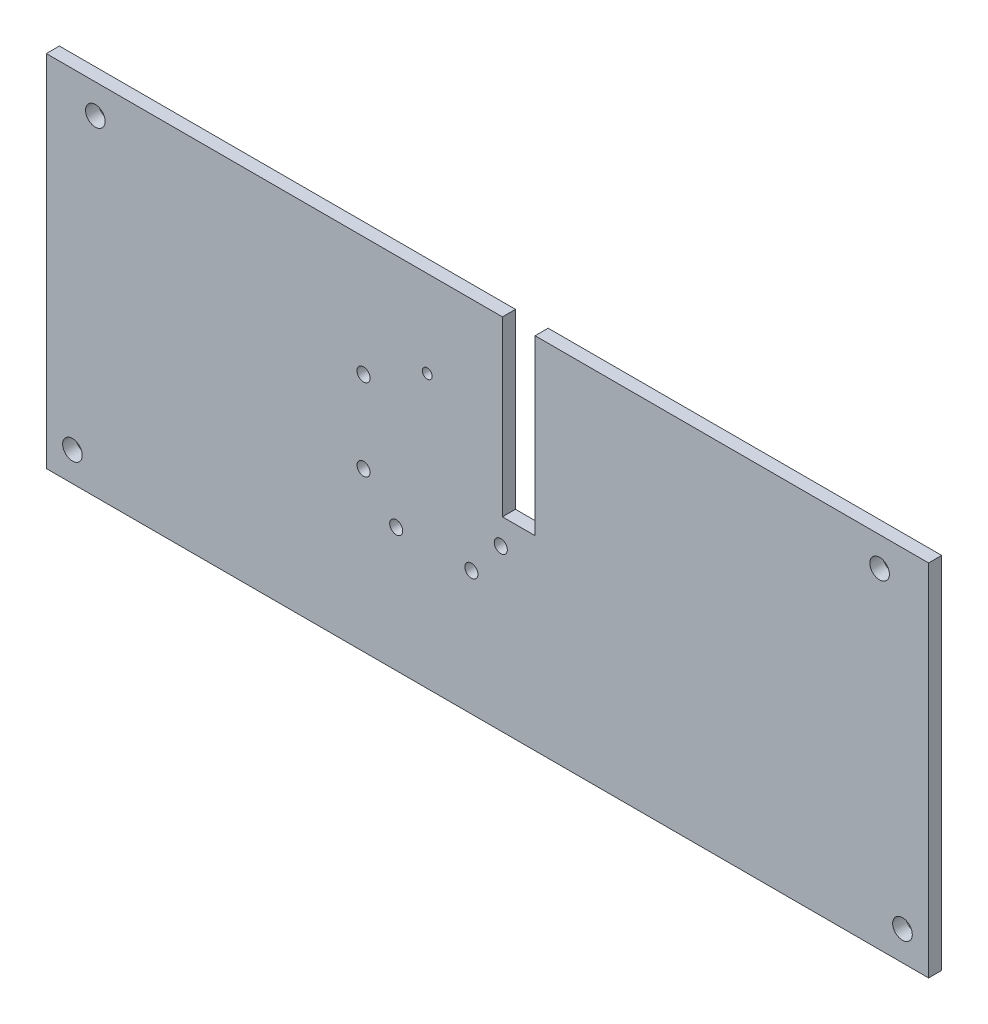
ISO-10303-21;
HEADER;
FILE_DESCRIPTION(('STEP AP214'),'2;1');
FILE_NAME('part.step','',(''),(''),'','','');
FILE_SCHEMA(('AUTOMOTIVE_DESIGN { 1 0 10303 214 1 1 1 1 }'));
ENDSEC;
DATA;
#1=APPLICATION_CONTEXT('core data for automotive mechanical design processes');
#2=APPLICATION_PROTOCOL_DEFINITION('international standard','automotive_design',2000,#1);
#3=PRODUCT_CONTEXT('',#1,'mechanical');
#4=PRODUCT('Part','Part','',(#3));
#5=PRODUCT_RELATED_PRODUCT_CATEGORY('part','',(#4));
#6=PRODUCT_DEFINITION_FORMATION('','',#4);
#7=PRODUCT_DEFINITION_CONTEXT('part definition',#1,'design');
#8=PRODUCT_DEFINITION('design','',#6,#7);
#9=PRODUCT_DEFINITION_SHAPE('','',#8);
#10=(LENGTH_UNIT() NAMED_UNIT(*) SI_UNIT(.MILLI.,.METRE.));
#11=(NAMED_UNIT(*) PLANE_ANGLE_UNIT() SI_UNIT($,.RADIAN.));
#12=(NAMED_UNIT(*) SI_UNIT($,.STERADIAN.) SOLID_ANGLE_UNIT());
#13=UNCERTAINTY_MEASURE_WITH_UNIT(LENGTH_MEASURE(1.E-05),#10,'distance_accuracy_value','');
#14=(GEOMETRIC_REPRESENTATION_CONTEXT(3) GLOBAL_UNCERTAINTY_ASSIGNED_CONTEXT((#13)) GLOBAL_UNIT_ASSIGNED_CONTEXT((#10,
#11,#12)) REPRESENTATION_CONTEXT('',''));
#15=CARTESIAN_POINT('',(0.,0.,0.));
#16=DIRECTION('',(0.,0.,1.));
#17=DIRECTION('',(1.,0.,0.));
#18=AXIS2_PLACEMENT_3D('',#15,#16,#17);
#19=CARTESIAN_POINT('',(135.,55.,4.));
#20=DIRECTION('',(0.,-1.,0.));
#21=DIRECTION('',(1.,0.,0.));
#22=AXIS2_PLACEMENT_3D('',#19,#20,#21);
#23=PLANE('',#22);
#24=DIRECTION('',(-1.,0.,0.));
#25=VECTOR('',#24,1.);
#26=CARTESIAN_POINT('',(135.,55.,4.));
#27=LINE('',#26,#25);
#28=CARTESIAN_POINT('',(4.57454043571604,55.,4.));
#29=VERTEX_POINT('',#28);
#30=CARTESIAN_POINT('',(-135.,55.,4.));
#31=VERTEX_POINT('',#30);
#32=EDGE_CURVE('E57',#29,#31,#27,.T.);
#33=ORIENTED_EDGE('',*,*,#32,.F.);
#34=DIRECTION('',(0.,0.,-1.));
#35=VECTOR('',#34,1.);
#36=CARTESIAN_POINT('',(4.57454043571604,55.,4.));
#37=LINE('',#36,#35);
#38=CARTESIAN_POINT('',(4.57454043571604,55.,0.));
#39=VERTEX_POINT('',#38);
#40=EDGE_CURVE('E108',#29,#39,#37,.T.);
#41=ORIENTED_EDGE('',*,*,#40,.T.);
#42=DIRECTION('',(-1.,0.,0.));
#43=VECTOR('',#42,1.);
#44=CARTESIAN_POINT('',(135.,55.,0.));
#45=LINE('',#44,#43);
#46=CARTESIAN_POINT('',(-135.,55.,0.));
#47=VERTEX_POINT('',#46);
#48=EDGE_CURVE('E79',#39,#47,#45,.T.);
#49=ORIENTED_EDGE('',*,*,#48,.T.);
#50=DIRECTION('',(0.,0.,-1.));
#51=VECTOR('',#50,1.);
#52=CARTESIAN_POINT('',(-135.,55.,4.));
#53=LINE('',#52,#51);
#54=EDGE_CURVE('E122',#31,#47,#53,.T.);
#55=ORIENTED_EDGE('',*,*,#54,.F.);
#56=EDGE_LOOP('',(#33,#41,#49,#55));
#57=FACE_BOUND('',#56,.T.);
#58=ADVANCED_FACE('F33',(#57),#23,.F.);
#59=CARTESIAN_POINT('',(-135.,55.,4.));
#60=DIRECTION('',(1.,0.,0.));
#61=DIRECTION('',(0.,1.,0.));
#62=AXIS2_PLACEMENT_3D('',#59,#60,#61);
#63=PLANE('',#62);
#64=DIRECTION('',(0.,-1.,0.));
#65=VECTOR('',#64,1.);
#66=CARTESIAN_POINT('',(-135.,55.,0.));
#67=LINE('',#66,#65);
#68=CARTESIAN_POINT('',(-135.,-55.,0.));
#69=VERTEX_POINT('',#68);
#70=EDGE_CURVE('E131',#47,#69,#67,.T.);
#71=ORIENTED_EDGE('',*,*,#70,.T.);
#72=DIRECTION('',(0.,0.,-1.));
#73=VECTOR('',#72,1.);
#74=CARTESIAN_POINT('',(-135.,-55.,4.));
#75=LINE('',#74,#73);
#76=CARTESIAN_POINT('',(-135.,-55.,4.));
#77=VERTEX_POINT('',#76);
#78=EDGE_CURVE('E11',#77,#69,#75,.T.);
#79=ORIENTED_EDGE('',*,*,#78,.F.);
#80=DIRECTION('',(0.,-1.,0.));
#81=VECTOR('',#80,1.);
#82=CARTESIAN_POINT('',(-135.,55.,4.));
#83=LINE('',#82,#81);
#84=EDGE_CURVE('E142',#31,#77,#83,.T.);
#85=ORIENTED_EDGE('',*,*,#84,.F.);
#86=ORIENTED_EDGE('',*,*,#54,.T.);
#87=EDGE_LOOP('',(#71,#79,#85,#86));
#88=FACE_BOUND('',#87,.T.);
#89=ADVANCED_FACE('F35',(#88),#63,.F.);
#90=CARTESIAN_POINT('',(135.,-55.,4.));
#91=DIRECTION('',(0.,1.,0.));
#92=DIRECTION('',(-1.,0.,0.));
#93=AXIS2_PLACEMENT_3D('',#90,#91,#92);
#94=PLANE('',#93);
#95=DIRECTION('',(1.,0.,0.));
#96=VECTOR('',#95,1.);
#97=CARTESIAN_POINT('',(135.,-55.,0.));
#98=LINE('',#97,#96);
#99=CARTESIAN_POINT('',(135.,-55.,0.));
#100=VERTEX_POINT('',#99);
#101=EDGE_CURVE('E134',#69,#100,#98,.T.);
#102=ORIENTED_EDGE('',*,*,#101,.T.);
#103=DIRECTION('',(0.,0.,-1.));
#104=VECTOR('',#103,1.);
#105=CARTESIAN_POINT('',(135.,-55.,4.));
#106=LINE('',#105,#104);
#107=CARTESIAN_POINT('',(135.,-55.,4.));
#108=VERTEX_POINT('',#107);
#109=EDGE_CURVE('E41',#108,#100,#106,.T.);
#110=ORIENTED_EDGE('',*,*,#109,.F.);
#111=DIRECTION('',(1.,0.,0.));
#112=VECTOR('',#111,1.);
#113=CARTESIAN_POINT('',(135.,-55.,4.));
#114=LINE('',#113,#112);
#115=EDGE_CURVE('E86',#77,#108,#114,.T.);
#116=ORIENTED_EDGE('',*,*,#115,.F.);
#117=ORIENTED_EDGE('',*,*,#78,.T.);
#118=EDGE_LOOP('',(#102,#110,#116,#117));
#119=FACE_BOUND('',#118,.T.);
#120=ADVANCED_FACE('F280',(#119),#94,.F.);
#121=CARTESIAN_POINT('',(135.,55.,4.));
#122=DIRECTION('',(-1.,0.,0.));
#123=DIRECTION('',(0.,-1.,0.));
#124=AXIS2_PLACEMENT_3D('',#121,#122,#123);
#125=PLANE('',#124);
#126=DIRECTION('',(0.,1.,0.));
#127=VECTOR('',#126,1.);
#128=CARTESIAN_POINT('',(135.,55.,0.));
#129=LINE('',#128,#127);
#130=CARTESIAN_POINT('',(135.,55.,0.));
#131=VERTEX_POINT('',#130);
#132=EDGE_CURVE('E137',#100,#131,#129,.T.);
#133=ORIENTED_EDGE('',*,*,#132,.T.);
#134=DIRECTION('',(0.,0.,-1.));
#135=VECTOR('',#134,1.);
#136=CARTESIAN_POINT('',(135.,55.,4.));
#137=LINE('',#136,#135);
#138=CARTESIAN_POINT('',(135.,55.,4.));
#139=VERTEX_POINT('',#138);
#140=EDGE_CURVE('E144',#139,#131,#137,.T.);
#141=ORIENTED_EDGE('',*,*,#140,.F.);
#142=DIRECTION('',(0.,1.,0.));
#143=VECTOR('',#142,1.);
#144=CARTESIAN_POINT('',(135.,55.,4.));
#145=LINE('',#144,#143);
#146=EDGE_CURVE('E125',#108,#139,#145,.T.);
#147=ORIENTED_EDGE('',*,*,#146,.F.);
#148=ORIENTED_EDGE('',*,*,#109,.T.);
#149=EDGE_LOOP('',(#133,#141,#147,#148));
#150=FACE_BOUND('',#149,.T.);
#151=ADVANCED_FACE('F150',(#150),#125,.F.);
#152=CARTESIAN_POINT('',(14.574540435716,55.,0.));
#153=VERTEX_POINT('',#152);
#154=EDGE_CURVE('E139',#131,#153,#45,.T.);
#155=ORIENTED_EDGE('',*,*,#154,.T.);
#156=DIRECTION('',(0.,0.,-1.));
#157=VECTOR('',#156,1.);
#158=CARTESIAN_POINT('',(14.574540435716,55.,4.));
#159=LINE('',#158,#157);
#160=CARTESIAN_POINT('',(14.574540435716,55.,4.));
#161=VERTEX_POINT('',#160);
#162=EDGE_CURVE('E48',#161,#153,#159,.T.);
#163=ORIENTED_EDGE('',*,*,#162,.F.);
#164=EDGE_CURVE('E124',#139,#161,#27,.T.);
#165=ORIENTED_EDGE('',*,*,#164,.F.);
#166=ORIENTED_EDGE('',*,*,#140,.T.);
#167=EDGE_LOOP('',(#155,#163,#165,#166));
#168=FACE_BOUND('',#167,.T.);
#169=ADVANCED_FACE('F160',(#168),#23,.F.);
#170=CARTESIAN_POINT('',(0.,0.,4.));
#171=DIRECTION('',(0.,0.,-1.));
#172=DIRECTION('',(-1.,0.,0.));
#173=AXIS2_PLACEMENT_3D('',#170,#171,#172);
#174=PLANE('',#173);
#175=CARTESIAN_POINT('',(-18.4254595642863,28.5,4.));
#176=DIRECTION('',(0.,0.,-1.));
#177=DIRECTION('',(-1.,0.,0.));
#178=AXIS2_PLACEMENT_3D('',#175,#176,#177);
#179=CIRCLE('',#178,1.5);
#180=CARTESIAN_POINT('',(-19.9254595642863,28.5,4.));
#181=VERTEX_POINT('',#180);
#182=EDGE_CURVE('E215',#181,#181,#179,.T.);
#183=ORIENTED_EDGE('',*,*,#182,.T.);
#184=EDGE_LOOP('',(#183));
#185=FACE_BOUND('',#184,.T.);
#186=CARTESIAN_POINT('',(-37.9254595642863,18.4999999999999,4.));
#187=DIRECTION('',(0.,0.,-1.));
#188=DIRECTION('',(-1.,0.,0.));
#189=AXIS2_PLACEMENT_3D('',#186,#187,#188);
#190=CIRCLE('',#189,2.);
#191=CARTESIAN_POINT('',(-39.9254595642863,18.4999999999999,4.));
#192=VERTEX_POINT('',#191);
#193=EDGE_CURVE('E221',#192,#192,#190,.T.);
#194=ORIENTED_EDGE('',*,*,#193,.T.);
#195=EDGE_LOOP('',(#194));
#196=FACE_BOUND('',#195,.T.);
#197=CARTESIAN_POINT('',(-37.9254595642863,-6.50000000000006,4.));
#198=DIRECTION('',(0.,0.,-1.));
#199=DIRECTION('',(-1.,0.,0.));
#200=AXIS2_PLACEMENT_3D('',#197,#198,#199);
#201=CIRCLE('',#200,2.);
#202=CARTESIAN_POINT('',(-39.9254595642863,-6.50000000000006,4.));
#203=VERTEX_POINT('',#202);
#204=EDGE_CURVE('E227',#203,#203,#201,.T.);
#205=ORIENTED_EDGE('',*,*,#204,.T.);
#206=EDGE_LOOP('',(#205));
#207=FACE_BOUND('',#206,.T.);
#208=CARTESIAN_POINT('',(-27.9254595642863,-17.0000000000001,4.));
#209=DIRECTION('',(0.,0.,-1.));
#210=DIRECTION('',(-1.,0.,0.));
#211=AXIS2_PLACEMENT_3D('',#208,#209,#210);
#212=CIRCLE('',#211,2.);
#213=CARTESIAN_POINT('',(-29.9254595642863,-17.0000000000001,4.));
#214=VERTEX_POINT('',#213);
#215=EDGE_CURVE('E187',#214,#214,#212,.T.);
#216=ORIENTED_EDGE('',*,*,#215,.T.);
#217=EDGE_LOOP('',(#216));
#218=FACE_BOUND('',#217,.T.);
#219=CARTESIAN_POINT('',(127.,-45.9999999999999,4.));
#220=DIRECTION('',(0.,0.,-1.));
#221=DIRECTION('',(-1.,0.,0.));
#222=AXIS2_PLACEMENT_3D('',#219,#220,#221);
#223=CIRCLE('',#222,3.00000000000001);
#224=CARTESIAN_POINT('',(124.,-45.9999999999999,4.));
#225=VERTEX_POINT('',#224);
#226=EDGE_CURVE('E168',#225,#225,#223,.T.);
#227=ORIENTED_EDGE('',*,*,#226,.T.);
#228=EDGE_LOOP('',(#227));
#229=FACE_BOUND('',#228,.T.);
#230=CARTESIAN_POINT('',(-120.,46.,4.));
#231=DIRECTION('',(0.,0.,-1.));
#232=DIRECTION('',(-1.,0.,0.));
#233=AXIS2_PLACEMENT_3D('',#230,#231,#232);
#234=CIRCLE('',#233,2.99999999999999);
#235=CARTESIAN_POINT('',(-123.,46.,4.));
#236=VERTEX_POINT('',#235);
#237=EDGE_CURVE('E174',#236,#236,#234,.T.);
#238=ORIENTED_EDGE('',*,*,#237,.T.);
#239=EDGE_LOOP('',(#238));
#240=FACE_BOUND('',#239,.T.);
#241=CARTESIAN_POINT('',(-127.,-46.,4.));
#242=DIRECTION('',(0.,0.,-1.));
#243=DIRECTION('',(-1.,0.,0.));
#244=AXIS2_PLACEMENT_3D('',#241,#242,#243);
#245=CIRCLE('',#244,2.99999999999999);
#246=CARTESIAN_POINT('',(-130.,-46.,4.));
#247=VERTEX_POINT('',#246);
#248=EDGE_CURVE('E175',#247,#247,#245,.T.);
#249=ORIENTED_EDGE('',*,*,#248,.T.);
#250=EDGE_LOOP('',(#249));
#251=FACE_BOUND('',#250,.T.);
#252=CARTESIAN_POINT('',(4.07454043571366,-6.00000000000006,4.));
#253=DIRECTION('',(0.,0.,-1.));
#254=DIRECTION('',(-1.,0.,0.));
#255=AXIS2_PLACEMENT_3D('',#252,#253,#254);
#256=CIRCLE('',#255,1.99999999999999);
#257=CARTESIAN_POINT('',(2.07454043571367,-6.00000000000006,4.));
#258=VERTEX_POINT('',#257);
#259=EDGE_CURVE('E193',#258,#258,#256,.T.);
#260=ORIENTED_EDGE('',*,*,#259,.T.);
#261=EDGE_LOOP('',(#260));
#262=FACE_BOUND('',#261,.T.);
#263=CARTESIAN_POINT('',(-4.92545956428634,-17.0000000000001,4.));
#264=DIRECTION('',(0.,0.,-1.));
#265=DIRECTION('',(-1.,0.,0.));
#266=AXIS2_PLACEMENT_3D('',#263,#264,#265);
#267=CIRCLE('',#266,2.);
#268=CARTESIAN_POINT('',(-6.92545956428634,-17.0000000000001,4.));
#269=VERTEX_POINT('',#268);
#270=EDGE_CURVE('E186',#269,#269,#267,.T.);
#271=ORIENTED_EDGE('',*,*,#270,.T.);
#272=EDGE_LOOP('',(#271));
#273=FACE_BOUND('',#272,.T.);
#274=CARTESIAN_POINT('',(120.,46.0000000000001,4.));
#275=DIRECTION('',(0.,0.,-1.));
#276=DIRECTION('',(-1.,0.,0.));
#277=AXIS2_PLACEMENT_3D('',#274,#275,#276);
#278=CIRCLE('',#277,3.00000000000001);
#279=CARTESIAN_POINT('',(117.,46.0000000000001,4.));
#280=VERTEX_POINT('',#279);
#281=EDGE_CURVE('E135',#280,#280,#278,.T.);
#282=ORIENTED_EDGE('',*,*,#281,.T.);
#283=EDGE_LOOP('',(#282));
#284=FACE_BOUND('',#283,.T.);
#285=DIRECTION('',(-1.,0.,0.));
#286=VECTOR('',#285,1.);
#287=CARTESIAN_POINT('',(4.57454043571638,2.00708867321768,4.));
#288=LINE('',#287,#286);
#289=CARTESIAN_POINT('',(14.5745404357164,2.00708867321768,4.));
#290=VERTEX_POINT('',#289);
#291=CARTESIAN_POINT('',(4.57454043571638,2.00708867321768,4.));
#292=VERTEX_POINT('',#291);
#293=EDGE_CURVE('E114',#290,#292,#288,.T.);
#294=ORIENTED_EDGE('',*,*,#293,.T.);
#295=DIRECTION('',(0.,1.,0.));
#296=VECTOR('',#295,1.);
#297=CARTESIAN_POINT('',(4.57454043571604,55.,4.));
#298=LINE('',#297,#296);
#299=EDGE_CURVE('E110',#292,#29,#298,.T.);
#300=ORIENTED_EDGE('',*,*,#299,.T.);
#301=ORIENTED_EDGE('',*,*,#32,.T.);
#302=ORIENTED_EDGE('',*,*,#84,.T.);
#303=ORIENTED_EDGE('',*,*,#115,.T.);
#304=ORIENTED_EDGE('',*,*,#146,.T.);
#305=ORIENTED_EDGE('',*,*,#164,.T.);
#306=DIRECTION('',(0.,-1.,0.));
#307=VECTOR('',#306,1.);
#308=CARTESIAN_POINT('',(14.5745404357164,2.00708867321768,4.));
#309=LINE('',#308,#307);
#310=EDGE_CURVE('E119',#161,#290,#309,.T.);
#311=ORIENTED_EDGE('',*,*,#310,.T.);
#312=EDGE_LOOP('',(#294,#300,#301,#302,#303,#304,#305,#311));
#313=FACE_BOUND('',#312,.T.);
#314=ADVANCED_FACE('F116',(#185,#196,#207,#218,#229,#240,#251,#262,#273,#284,#313),#174,.F.);
#315=CARTESIAN_POINT('',(0.,0.,0.));
#316=DIRECTION('',(0.,0.,-1.));
#317=DIRECTION('',(-1.,0.,0.));
#318=AXIS2_PLACEMENT_3D('',#315,#316,#317);
#319=PLANE('',#318);
#320=DIRECTION('',(0.,1.,0.));
#321=VECTOR('',#320,1.);
#322=CARTESIAN_POINT('',(4.57454043571604,55.,0.));
#323=LINE('',#322,#321);
#324=CARTESIAN_POINT('',(4.57454043571638,2.00708867321768,0.));
#325=VERTEX_POINT('',#324);
#326=EDGE_CURVE('E113',#325,#39,#323,.T.);
#327=ORIENTED_EDGE('',*,*,#326,.F.);
#328=DIRECTION('',(-1.,0.,0.));
#329=VECTOR('',#328,1.);
#330=CARTESIAN_POINT('',(4.57454043571638,2.00708867321768,0.));
#331=LINE('',#330,#329);
#332=CARTESIAN_POINT('',(14.5745404357164,2.00708867321768,0.));
#333=VERTEX_POINT('',#332);
#334=EDGE_CURVE('E120',#333,#325,#331,.T.);
#335=ORIENTED_EDGE('',*,*,#334,.F.);
#336=DIRECTION('',(0.,-1.,0.));
#337=VECTOR('',#336,1.);
#338=CARTESIAN_POINT('',(14.5745404357164,2.00708867321768,0.));
#339=LINE('',#338,#337);
#340=EDGE_CURVE('E158',#153,#333,#339,.T.);
#341=ORIENTED_EDGE('',*,*,#340,.F.);
#342=ORIENTED_EDGE('',*,*,#154,.F.);
#343=ORIENTED_EDGE('',*,*,#132,.F.);
#344=ORIENTED_EDGE('',*,*,#101,.F.);
#345=ORIENTED_EDGE('',*,*,#70,.F.);
#346=ORIENTED_EDGE('',*,*,#48,.F.);
#347=EDGE_LOOP('',(#327,#335,#341,#342,#343,#344,#345,#346));
#348=FACE_BOUND('',#347,.T.);
#349=CARTESIAN_POINT('',(-18.4254595642863,28.5,0.));
#350=DIRECTION('',(0.,0.,-1.));
#351=DIRECTION('',(-1.,0.,0.));
#352=AXIS2_PLACEMENT_3D('',#349,#350,#351);
#353=CIRCLE('',#352,1.5);
#354=CARTESIAN_POINT('',(-19.9254595642863,28.5,0.));
#355=VERTEX_POINT('',#354);
#356=EDGE_CURVE('E206',#355,#355,#353,.T.);
#357=ORIENTED_EDGE('',*,*,#356,.F.);
#358=EDGE_LOOP('',(#357));
#359=FACE_BOUND('',#358,.T.);
#360=CARTESIAN_POINT('',(-37.9254595642863,18.4999999999999,0.));
#361=DIRECTION('',(0.,0.,-1.));
#362=DIRECTION('',(-1.,0.,0.));
#363=AXIS2_PLACEMENT_3D('',#360,#361,#362);
#364=CIRCLE('',#363,2.);
#365=CARTESIAN_POINT('',(-39.9254595642863,18.4999999999999,0.));
#366=VERTEX_POINT('',#365);
#367=EDGE_CURVE('E218',#366,#366,#364,.T.);
#368=ORIENTED_EDGE('',*,*,#367,.F.);
#369=EDGE_LOOP('',(#368));
#370=FACE_BOUND('',#369,.T.);
#371=CARTESIAN_POINT('',(-37.9254595642863,-6.50000000000006,0.));
#372=DIRECTION('',(0.,0.,-1.));
#373=DIRECTION('',(-1.,0.,0.));
#374=AXIS2_PLACEMENT_3D('',#371,#372,#373);
#375=CIRCLE('',#374,2.);
#376=CARTESIAN_POINT('',(-39.9254595642863,-6.50000000000006,0.));
#377=VERTEX_POINT('',#376);
#378=EDGE_CURVE('E224',#377,#377,#375,.T.);
#379=ORIENTED_EDGE('',*,*,#378,.F.);
#380=EDGE_LOOP('',(#379));
#381=FACE_BOUND('',#380,.T.);
#382=CARTESIAN_POINT('',(-27.9254595642863,-17.0000000000001,0.));
#383=DIRECTION('',(0.,0.,-1.));
#384=DIRECTION('',(-1.,0.,0.));
#385=AXIS2_PLACEMENT_3D('',#382,#383,#384);
#386=CIRCLE('',#385,2.);
#387=CARTESIAN_POINT('',(-29.9254595642863,-17.0000000000001,0.));
#388=VERTEX_POINT('',#387);
#389=EDGE_CURVE('E230',#388,#388,#386,.T.);
#390=ORIENTED_EDGE('',*,*,#389,.F.);
#391=EDGE_LOOP('',(#390));
#392=FACE_BOUND('',#391,.T.);
#393=CARTESIAN_POINT('',(127.,-45.9999999999999,0.));
#394=DIRECTION('',(0.,0.,-1.));
#395=DIRECTION('',(-1.,0.,0.));
#396=AXIS2_PLACEMENT_3D('',#393,#394,#395);
#397=CIRCLE('',#396,3.00000000000001);
#398=CARTESIAN_POINT('',(124.,-45.9999999999999,0.));
#399=VERTEX_POINT('',#398);
#400=EDGE_CURVE('E178',#399,#399,#397,.T.);
#401=ORIENTED_EDGE('',*,*,#400,.F.);
#402=EDGE_LOOP('',(#401));
#403=FACE_BOUND('',#402,.T.);
#404=CARTESIAN_POINT('',(-120.,46.,0.));
#405=DIRECTION('',(0.,0.,-1.));
#406=DIRECTION('',(-1.,0.,0.));
#407=AXIS2_PLACEMENT_3D('',#404,#405,#406);
#408=CIRCLE('',#407,2.99999999999999);
#409=CARTESIAN_POINT('',(-123.,46.,0.));
#410=VERTEX_POINT('',#409);
#411=EDGE_CURVE('E171',#410,#410,#408,.T.);
#412=ORIENTED_EDGE('',*,*,#411,.F.);
#413=EDGE_LOOP('',(#412));
#414=FACE_BOUND('',#413,.T.);
#415=CARTESIAN_POINT('',(-127.,-46.,0.));
#416=DIRECTION('',(0.,0.,-1.));
#417=DIRECTION('',(-1.,0.,0.));
#418=AXIS2_PLACEMENT_3D('',#415,#416,#417);
#419=CIRCLE('',#418,2.99999999999999);
#420=CARTESIAN_POINT('',(-130.,-46.,0.));
#421=VERTEX_POINT('',#420);
#422=EDGE_CURVE('E196',#421,#421,#419,.T.);
#423=ORIENTED_EDGE('',*,*,#422,.F.);
#424=EDGE_LOOP('',(#423));
#425=FACE_BOUND('',#424,.T.);
#426=CARTESIAN_POINT('',(4.07454043571366,-6.00000000000006,0.));
#427=DIRECTION('',(0.,0.,-1.));
#428=DIRECTION('',(-1.,0.,0.));
#429=AXIS2_PLACEMENT_3D('',#426,#427,#428);
#430=CIRCLE('',#429,1.99999999999999);
#431=CARTESIAN_POINT('',(2.07454043571367,-6.00000000000006,0.));
#432=VERTEX_POINT('',#431);
#433=EDGE_CURVE('E190',#432,#432,#430,.T.);
#434=ORIENTED_EDGE('',*,*,#433,.F.);
#435=EDGE_LOOP('',(#434));
#436=FACE_BOUND('',#435,.T.);
#437=CARTESIAN_POINT('',(-4.92545956428634,-17.0000000000001,0.));
#438=DIRECTION('',(0.,0.,-1.));
#439=DIRECTION('',(-1.,0.,0.));
#440=AXIS2_PLACEMENT_3D('',#437,#438,#439);
#441=CIRCLE('',#440,2.);
#442=CARTESIAN_POINT('',(-6.92545956428634,-17.0000000000001,0.));
#443=VERTEX_POINT('',#442);
#444=EDGE_CURVE('E183',#443,#443,#441,.T.);
#445=ORIENTED_EDGE('',*,*,#444,.F.);
#446=EDGE_LOOP('',(#445));
#447=FACE_BOUND('',#446,.T.);
#448=CARTESIAN_POINT('',(120.,46.0000000000001,0.));
#449=DIRECTION('',(0.,0.,-1.));
#450=DIRECTION('',(-1.,0.,0.));
#451=AXIS2_PLACEMENT_3D('',#448,#449,#450);
#452=CIRCLE('',#451,3.00000000000001);
#453=CARTESIAN_POINT('',(117.,46.0000000000001,0.));
#454=VERTEX_POINT('',#453);
#455=EDGE_CURVE('E165',#454,#454,#452,.T.);
#456=ORIENTED_EDGE('',*,*,#455,.F.);
#457=EDGE_LOOP('',(#456));
#458=FACE_BOUND('',#457,.T.);
#459=ADVANCED_FACE('F154',(#348,#359,#370,#381,#392,#403,#414,#425,#436,#447,#458),#319,.T.);
#460=CARTESIAN_POINT('',(120.,46.0000000000001,4.));
#461=DIRECTION('',(0.,0.,-1.));
#462=DIRECTION('',(-1.,0.,0.));
#463=AXIS2_PLACEMENT_3D('',#460,#461,#462);
#464=CYLINDRICAL_SURFACE('',#463,3.00000000000001);
#465=ORIENTED_EDGE('',*,*,#281,.F.);
#466=EDGE_LOOP('',(#465));
#467=FACE_BOUND('',#466,.T.);
#468=ORIENTED_EDGE('',*,*,#455,.T.);
#469=EDGE_LOOP('',(#468));
#470=FACE_BOUND('',#469,.T.);
#471=ADVANCED_FACE('F248',(#467,#470),#464,.F.);
#472=CARTESIAN_POINT('',(-4.92545956428634,-17.0000000000001,4.));
#473=DIRECTION('',(0.,0.,-1.));
#474=DIRECTION('',(-1.,0.,0.));
#475=AXIS2_PLACEMENT_3D('',#472,#473,#474);
#476=CYLINDRICAL_SURFACE('',#475,2.);
#477=ORIENTED_EDGE('',*,*,#270,.F.);
#478=EDGE_LOOP('',(#477));
#479=FACE_BOUND('',#478,.T.);
#480=ORIENTED_EDGE('',*,*,#444,.T.);
#481=EDGE_LOOP('',(#480));
#482=FACE_BOUND('',#481,.T.);
#483=ADVANCED_FACE('F263',(#479,#482),#476,.F.);
#484=CARTESIAN_POINT('',(4.07454043571366,-6.00000000000006,4.));
#485=DIRECTION('',(0.,0.,-1.));
#486=DIRECTION('',(-1.,0.,0.));
#487=AXIS2_PLACEMENT_3D('',#484,#485,#486);
#488=CYLINDRICAL_SURFACE('',#487,1.99999999999999);
#489=ORIENTED_EDGE('',*,*,#259,.F.);
#490=EDGE_LOOP('',(#489));
#491=FACE_BOUND('',#490,.T.);
#492=ORIENTED_EDGE('',*,*,#433,.T.);
#493=EDGE_LOOP('',(#492));
#494=FACE_BOUND('',#493,.T.);
#495=ADVANCED_FACE('F269',(#491,#494),#488,.F.);
#496=CARTESIAN_POINT('',(-127.,-46.,4.));
#497=DIRECTION('',(0.,0.,-1.));
#498=DIRECTION('',(-1.,0.,0.));
#499=AXIS2_PLACEMENT_3D('',#496,#497,#498);
#500=CYLINDRICAL_SURFACE('',#499,2.99999999999999);
#501=ORIENTED_EDGE('',*,*,#248,.F.);
#502=EDGE_LOOP('',(#501));
#503=FACE_BOUND('',#502,.T.);
#504=ORIENTED_EDGE('',*,*,#422,.T.);
#505=EDGE_LOOP('',(#504));
#506=FACE_BOUND('',#505,.T.);
#507=ADVANCED_FACE('F308',(#503,#506),#500,.F.);
#508=CARTESIAN_POINT('',(-120.,46.,4.));
#509=DIRECTION('',(0.,0.,-1.));
#510=DIRECTION('',(-1.,0.,0.));
#511=AXIS2_PLACEMENT_3D('',#508,#509,#510);
#512=CYLINDRICAL_SURFACE('',#511,2.99999999999999);
#513=ORIENTED_EDGE('',*,*,#237,.F.);
#514=EDGE_LOOP('',(#513));
#515=FACE_BOUND('',#514,.T.);
#516=ORIENTED_EDGE('',*,*,#411,.T.);
#517=EDGE_LOOP('',(#516));
#518=FACE_BOUND('',#517,.T.);
#519=ADVANCED_FACE('F311',(#515,#518),#512,.F.);
#520=CARTESIAN_POINT('',(127.,-45.9999999999999,4.));
#521=DIRECTION('',(0.,0.,-1.));
#522=DIRECTION('',(-1.,0.,0.));
#523=AXIS2_PLACEMENT_3D('',#520,#521,#522);
#524=CYLINDRICAL_SURFACE('',#523,3.00000000000001);
#525=ORIENTED_EDGE('',*,*,#226,.F.);
#526=EDGE_LOOP('',(#525));
#527=FACE_BOUND('',#526,.T.);
#528=ORIENTED_EDGE('',*,*,#400,.T.);
#529=EDGE_LOOP('',(#528));
#530=FACE_BOUND('',#529,.T.);
#531=ADVANCED_FACE('F242',(#527,#530),#524,.F.);
#532=CARTESIAN_POINT('',(-27.9254595642863,-17.0000000000001,4.));
#533=DIRECTION('',(0.,0.,-1.));
#534=DIRECTION('',(-1.,0.,0.));
#535=AXIS2_PLACEMENT_3D('',#532,#533,#534);
#536=CYLINDRICAL_SURFACE('',#535,2.);
#537=ORIENTED_EDGE('',*,*,#215,.F.);
#538=EDGE_LOOP('',(#537));
#539=FACE_BOUND('',#538,.T.);
#540=ORIENTED_EDGE('',*,*,#389,.T.);
#541=EDGE_LOOP('',(#540));
#542=FACE_BOUND('',#541,.T.);
#543=ADVANCED_FACE('F238',(#539,#542),#536,.F.);
#544=CARTESIAN_POINT('',(-37.9254595642863,-6.50000000000006,4.));
#545=DIRECTION('',(0.,0.,-1.));
#546=DIRECTION('',(-1.,0.,0.));
#547=AXIS2_PLACEMENT_3D('',#544,#545,#546);
#548=CYLINDRICAL_SURFACE('',#547,2.);
#549=ORIENTED_EDGE('',*,*,#204,.F.);
#550=EDGE_LOOP('',(#549));
#551=FACE_BOUND('',#550,.T.);
#552=ORIENTED_EDGE('',*,*,#378,.T.);
#553=EDGE_LOOP('',(#552));
#554=FACE_BOUND('',#553,.T.);
#555=ADVANCED_FACE('F241',(#551,#554),#548,.F.);
#556=CARTESIAN_POINT('',(-37.9254595642863,18.4999999999999,4.));
#557=DIRECTION('',(0.,0.,-1.));
#558=DIRECTION('',(-1.,0.,0.));
#559=AXIS2_PLACEMENT_3D('',#556,#557,#558);
#560=CYLINDRICAL_SURFACE('',#559,2.);
#561=ORIENTED_EDGE('',*,*,#193,.F.);
#562=EDGE_LOOP('',(#561));
#563=FACE_BOUND('',#562,.T.);
#564=ORIENTED_EDGE('',*,*,#367,.T.);
#565=EDGE_LOOP('',(#564));
#566=FACE_BOUND('',#565,.T.);
#567=ADVANCED_FACE('F351',(#563,#566),#560,.F.);
#568=CARTESIAN_POINT('',(-18.4254595642863,28.5,4.));
#569=DIRECTION('',(0.,0.,-1.));
#570=DIRECTION('',(-1.,0.,0.));
#571=AXIS2_PLACEMENT_3D('',#568,#569,#570);
#572=CYLINDRICAL_SURFACE('',#571,1.5);
#573=ORIENTED_EDGE('',*,*,#182,.F.);
#574=EDGE_LOOP('',(#573));
#575=FACE_BOUND('',#574,.T.);
#576=ORIENTED_EDGE('',*,*,#356,.T.);
#577=EDGE_LOOP('',(#576));
#578=FACE_BOUND('',#577,.T.);
#579=ADVANCED_FACE('F307',(#575,#578),#572,.F.);
#580=CARTESIAN_POINT('',(4.57454043571604,55.,4.));
#581=DIRECTION('',(-1.,0.,0.));
#582=DIRECTION('',(0.,-1.,0.));
#583=AXIS2_PLACEMENT_3D('',#580,#581,#582);
#584=PLANE('',#583);
#585=ORIENTED_EDGE('',*,*,#326,.T.);
#586=ORIENTED_EDGE('',*,*,#40,.F.);
#587=ORIENTED_EDGE('',*,*,#299,.F.);
#588=DIRECTION('',(0.,0.,-1.));
#589=VECTOR('',#588,1.);
#590=CARTESIAN_POINT('',(4.57454043571638,2.00708867321768,4.));
#591=LINE('',#590,#589);
#592=EDGE_CURVE('E204',#292,#325,#591,.T.);
#593=ORIENTED_EDGE('',*,*,#592,.T.);
#594=EDGE_LOOP('',(#585,#586,#587,#593));
#595=FACE_BOUND('',#594,.T.);
#596=ADVANCED_FACE('F109',(#595),#584,.F.);
#597=CARTESIAN_POINT('',(4.57454043571638,2.00708867321768,4.));
#598=DIRECTION('',(0.,-1.,0.));
#599=DIRECTION('',(0.,0.,-1.));
#600=AXIS2_PLACEMENT_3D('',#597,#598,#599);
#601=PLANE('',#600);
#602=ORIENTED_EDGE('',*,*,#334,.T.);
#603=ORIENTED_EDGE('',*,*,#592,.F.);
#604=ORIENTED_EDGE('',*,*,#293,.F.);
#605=DIRECTION('',(0.,0.,-1.));
#606=VECTOR('',#605,1.);
#607=CARTESIAN_POINT('',(14.5745404357164,2.00708867321768,4.));
#608=LINE('',#607,#606);
#609=EDGE_CURVE('E202',#290,#333,#608,.T.);
#610=ORIENTED_EDGE('',*,*,#609,.T.);
#611=EDGE_LOOP('',(#602,#603,#604,#610));
#612=FACE_BOUND('',#611,.T.);
#613=ADVANCED_FACE('F295',(#612),#601,.F.);
#614=CARTESIAN_POINT('',(14.5745404357164,2.00708867321768,4.));
#615=DIRECTION('',(1.,0.,0.));
#616=DIRECTION('',(0.,1.,0.));
#617=AXIS2_PLACEMENT_3D('',#614,#615,#616);
#618=PLANE('',#617);
#619=ORIENTED_EDGE('',*,*,#340,.T.);
#620=ORIENTED_EDGE('',*,*,#609,.F.);
#621=ORIENTED_EDGE('',*,*,#310,.F.);
#622=ORIENTED_EDGE('',*,*,#162,.T.);
#623=EDGE_LOOP('',(#619,#620,#621,#622));
#624=FACE_BOUND('',#623,.T.);
#625=ADVANCED_FACE('F296',(#624),#618,.F.);
#626=CLOSED_SHELL('',(#58,#89,#120,#151,#169,#314,#459,#471,#483,#495,#507,#519,#531,#543,#555,
#567,#579,#596,#613,#625));
#627=MANIFOLD_SOLID_BREP('B2',#626);
#628=ADVANCED_BREP_SHAPE_REPRESENTATION('',(#18,#627),#14);
#629=SHAPE_DEFINITION_REPRESENTATION(#9,#628);
ENDSEC;
END-ISO-10303-21;
